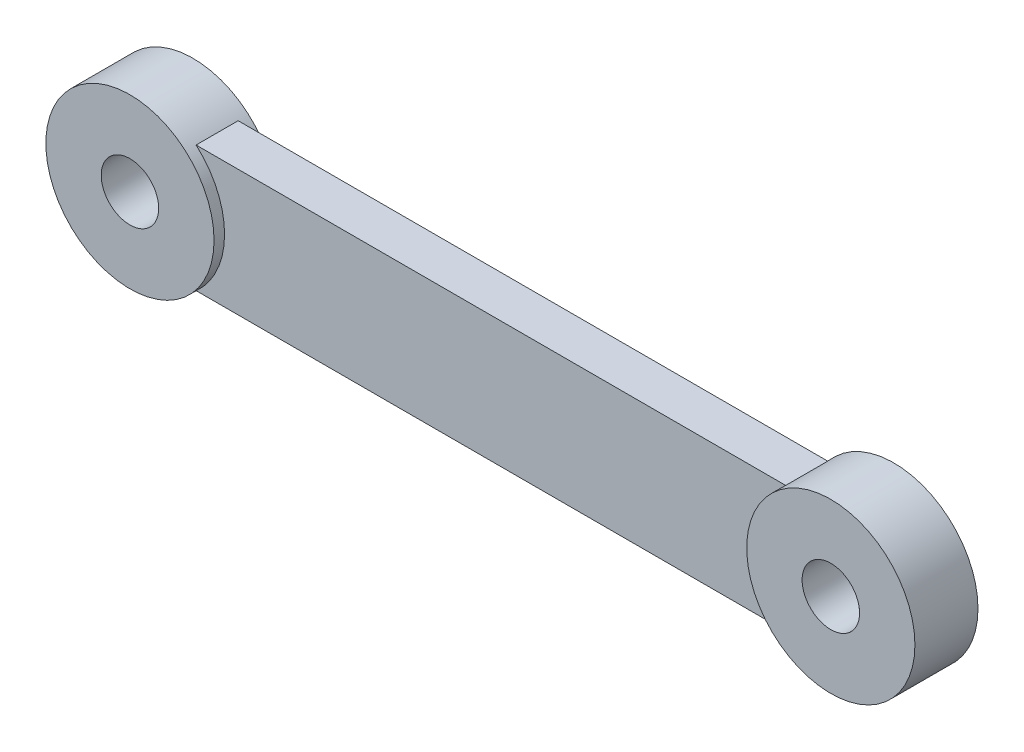
ISO-10303-21;
HEADER;
FILE_DESCRIPTION(('STEP AP214'),'2;1');
FILE_NAME('part.step','',(''),(''),'','','');
FILE_SCHEMA(('AUTOMOTIVE_DESIGN { 1 0 10303 214 1 1 1 1 }'));
ENDSEC;
DATA;
#1=APPLICATION_CONTEXT('core data for automotive mechanical design processes');
#2=APPLICATION_PROTOCOL_DEFINITION('international standard','automotive_design',2000,#1);
#3=PRODUCT_CONTEXT('',#1,'mechanical');
#4=PRODUCT('Part','Part','',(#3));
#5=PRODUCT_RELATED_PRODUCT_CATEGORY('part','',(#4));
#6=PRODUCT_DEFINITION_FORMATION('','',#4);
#7=PRODUCT_DEFINITION_CONTEXT('part definition',#1,'design');
#8=PRODUCT_DEFINITION('design','',#6,#7);
#9=PRODUCT_DEFINITION_SHAPE('','',#8);
#10=(LENGTH_UNIT() NAMED_UNIT(*) SI_UNIT(.MILLI.,.METRE.));
#11=(NAMED_UNIT(*) PLANE_ANGLE_UNIT() SI_UNIT($,.RADIAN.));
#12=(NAMED_UNIT(*) SI_UNIT($,.STERADIAN.) SOLID_ANGLE_UNIT());
#13=UNCERTAINTY_MEASURE_WITH_UNIT(LENGTH_MEASURE(1.E-05),#10,'distance_accuracy_value','');
#14=(GEOMETRIC_REPRESENTATION_CONTEXT(3) GLOBAL_UNCERTAINTY_ASSIGNED_CONTEXT((#13)) GLOBAL_UNIT_ASSIGNED_CONTEXT((#10,
#11,#12)) REPRESENTATION_CONTEXT('',''));
#15=CARTESIAN_POINT('',(0.,0.,0.));
#16=DIRECTION('',(0.,0.,1.));
#17=DIRECTION('',(1.,0.,0.));
#18=AXIS2_PLACEMENT_3D('',#15,#16,#17);
#19=CARTESIAN_POINT('',(0.,-9.,-3.));
#20=DIRECTION('',(0.,-1.,0.));
#21=DIRECTION('',(0.,0.,-1.));
#22=AXIS2_PLACEMENT_3D('',#19,#20,#21);
#23=PLANE('',#22);
#24=DIRECTION('',(0.,0.,1.));
#25=VECTOR('',#24,1.);
#26=CARTESIAN_POINT('',(42.0627460668063,-9.,-3.));
#27=LINE('',#26,#25);
#28=CARTESIAN_POINT('',(42.0627460668063,-9.,-3.));
#29=VERTEX_POINT('',#28);
#30=CARTESIAN_POINT('',(42.0627460668063,-9.,3.));
#31=VERTEX_POINT('',#30);
#32=EDGE_CURVE('E11',#29,#31,#27,.T.);
#33=ORIENTED_EDGE('',*,*,#32,.T.);
#34=DIRECTION('',(1.,0.,0.));
#35=VECTOR('',#34,1.);
#36=CARTESIAN_POINT('',(0.,-9.,3.));
#37=LINE('',#36,#35);
#38=CARTESIAN_POINT('',(-42.0627460668062,-9.,3.));
#39=VERTEX_POINT('',#38);
#40=EDGE_CURVE('E78',#39,#31,#37,.T.);
#41=ORIENTED_EDGE('',*,*,#40,.F.);
#42=DIRECTION('',(0.,0.,1.));
#43=VECTOR('',#42,1.);
#44=CARTESIAN_POINT('',(-42.0627460668062,-9.,-3.));
#45=LINE('',#44,#43);
#46=CARTESIAN_POINT('',(-42.0627460668062,-9.,-3.));
#47=VERTEX_POINT('',#46);
#48=EDGE_CURVE('E46',#47,#39,#45,.T.);
#49=ORIENTED_EDGE('',*,*,#48,.F.);
#50=DIRECTION('',(1.,0.,0.));
#51=VECTOR('',#50,1.);
#52=CARTESIAN_POINT('',(0.,-9.,-3.));
#53=LINE('',#52,#51);
#54=EDGE_CURVE('E87',#47,#29,#53,.T.);
#55=ORIENTED_EDGE('',*,*,#54,.T.);
#56=EDGE_LOOP('',(#33,#41,#49,#55));
#57=FACE_BOUND('',#56,.T.);
#58=ADVANCED_FACE('F37',(#57),#23,.T.);
#59=CARTESIAN_POINT('',(0.,9.,-3.));
#60=DIRECTION('',(0.,-1.,0.));
#61=DIRECTION('',(0.,0.,-1.));
#62=AXIS2_PLACEMENT_3D('',#59,#60,#61);
#63=PLANE('',#62);
#64=DIRECTION('',(0.,0.,1.));
#65=VECTOR('',#64,1.);
#66=CARTESIAN_POINT('',(-42.0627460668062,9.,-3.));
#67=LINE('',#66,#65);
#68=CARTESIAN_POINT('',(-42.0627460668062,9.,-3.));
#69=VERTEX_POINT('',#68);
#70=CARTESIAN_POINT('',(-42.0627460668062,9.,3.));
#71=VERTEX_POINT('',#70);
#72=EDGE_CURVE('E110',#69,#71,#67,.T.);
#73=ORIENTED_EDGE('',*,*,#72,.T.);
#74=DIRECTION('',(1.,0.,0.));
#75=VECTOR('',#74,1.);
#76=CARTESIAN_POINT('',(0.,9.,3.));
#77=LINE('',#76,#75);
#78=CARTESIAN_POINT('',(42.0627460668063,9.,3.));
#79=VERTEX_POINT('',#78);
#80=EDGE_CURVE('E92',#71,#79,#77,.T.);
#81=ORIENTED_EDGE('',*,*,#80,.T.);
#82=DIRECTION('',(0.,0.,1.));
#83=VECTOR('',#82,1.);
#84=CARTESIAN_POINT('',(42.0627460668063,9.,-3.));
#85=LINE('',#84,#83);
#86=CARTESIAN_POINT('',(42.0627460668063,9.,-3.));
#87=VERTEX_POINT('',#86);
#88=EDGE_CURVE('E41',#87,#79,#85,.T.);
#89=ORIENTED_EDGE('',*,*,#88,.F.);
#90=DIRECTION('',(1.,0.,0.));
#91=VECTOR('',#90,1.);
#92=CARTESIAN_POINT('',(0.,9.,-3.));
#93=LINE('',#92,#91);
#94=EDGE_CURVE('E105',#69,#87,#93,.T.);
#95=ORIENTED_EDGE('',*,*,#94,.F.);
#96=EDGE_LOOP('',(#73,#81,#89,#95));
#97=FACE_BOUND('',#96,.T.);
#98=ADVANCED_FACE('F39',(#97),#63,.F.);
#99=CARTESIAN_POINT('',(0.,0.,-3.));
#100=DIRECTION('',(0.,0.,1.));
#101=DIRECTION('',(1.,0.,0.));
#102=AXIS2_PLACEMENT_3D('',#99,#100,#101);
#103=PLANE('',#102);
#104=CARTESIAN_POINT('',(50.,0.,-3.));
#105=DIRECTION('',(0.,0.,1.));
#106=DIRECTION('',(1.,0.,0.));
#107=AXIS2_PLACEMENT_3D('',#104,#105,#106);
#108=CIRCLE('',#107,12.);
#109=EDGE_CURVE('E54',#87,#29,#108,.T.);
#110=ORIENTED_EDGE('',*,*,#109,.T.);
#111=ORIENTED_EDGE('',*,*,#54,.F.);
#112=CARTESIAN_POINT('',(-50.,0.,-3.));
#113=DIRECTION('',(0.,0.,1.));
#114=DIRECTION('',(1.,0.,0.));
#115=AXIS2_PLACEMENT_3D('',#112,#113,#114);
#116=CIRCLE('',#115,12.);
#117=EDGE_CURVE('E107',#47,#69,#116,.T.);
#118=ORIENTED_EDGE('',*,*,#117,.T.);
#119=ORIENTED_EDGE('',*,*,#94,.T.);
#120=EDGE_LOOP('',(#110,#111,#118,#119));
#121=FACE_BOUND('',#120,.T.);
#122=ADVANCED_FACE('F118',(#121),#103,.F.);
#123=CARTESIAN_POINT('',(0.,0.,3.));
#124=DIRECTION('',(0.,0.,1.));
#125=DIRECTION('',(1.,0.,0.));
#126=AXIS2_PLACEMENT_3D('',#123,#124,#125);
#127=PLANE('',#126);
#128=CARTESIAN_POINT('',(50.,0.,3.));
#129=DIRECTION('',(0.,0.,1.));
#130=DIRECTION('',(1.,0.,0.));
#131=AXIS2_PLACEMENT_3D('',#128,#129,#130);
#132=CIRCLE('',#131,12.);
#133=EDGE_CURVE('E81',#79,#31,#132,.T.);
#134=ORIENTED_EDGE('',*,*,#133,.F.);
#135=ORIENTED_EDGE('',*,*,#80,.F.);
#136=CARTESIAN_POINT('',(-50.,0.,3.));
#137=DIRECTION('',(0.,0.,1.));
#138=DIRECTION('',(1.,0.,0.));
#139=AXIS2_PLACEMENT_3D('',#136,#137,#138);
#140=CIRCLE('',#139,12.);
#141=EDGE_CURVE('E84',#39,#71,#140,.T.);
#142=ORIENTED_EDGE('',*,*,#141,.F.);
#143=ORIENTED_EDGE('',*,*,#40,.T.);
#144=EDGE_LOOP('',(#134,#135,#142,#143));
#145=FACE_BOUND('',#144,.T.);
#146=ADVANCED_FACE('F79',(#145),#127,.T.);
#147=CARTESIAN_POINT('',(-50.,0.,4.5));
#148=DIRECTION('',(0.,0.,-1.));
#149=DIRECTION('',(-1.,0.,0.));
#150=AXIS2_PLACEMENT_3D('',#147,#148,#149);
#151=CYLINDRICAL_SURFACE('',#150,12.);
#152=CARTESIAN_POINT('',(-50.,0.,4.5));
#153=DIRECTION('',(0.,0.,1.));
#154=DIRECTION('',(1.,0.,0.));
#155=AXIS2_PLACEMENT_3D('',#152,#153,#154);
#156=CIRCLE('',#155,12.);
#157=CARTESIAN_POINT('',(-38.,0.,4.5));
#158=VERTEX_POINT('',#157);
#159=EDGE_CURVE('E93',#158,#158,#156,.T.);
#160=ORIENTED_EDGE('',*,*,#159,.F.);
#161=EDGE_LOOP('',(#160));
#162=FACE_BOUND('',#161,.T.);
#163=CARTESIAN_POINT('',(-50.,0.,-4.5));
#164=DIRECTION('',(0.,0.,1.));
#165=DIRECTION('',(1.,0.,0.));
#166=AXIS2_PLACEMENT_3D('',#163,#164,#165);
#167=CIRCLE('',#166,12.);
#168=CARTESIAN_POINT('',(-38.,0.,-4.5));
#169=VERTEX_POINT('',#168);
#170=EDGE_CURVE('E100',#169,#169,#167,.T.);
#171=ORIENTED_EDGE('',*,*,#170,.T.);
#172=EDGE_LOOP('',(#171));
#173=FACE_BOUND('',#172,.T.);
#174=ORIENTED_EDGE('',*,*,#72,.F.);
#175=ORIENTED_EDGE('',*,*,#117,.F.);
#176=ORIENTED_EDGE('',*,*,#48,.T.);
#177=ORIENTED_EDGE('',*,*,#141,.T.);
#178=EDGE_LOOP('',(#174,#175,#176,#177));
#179=FACE_BOUND('',#178,.T.);
#180=ADVANCED_FACE('F117',(#162,#173,#179),#151,.T.);
#181=CARTESIAN_POINT('',(-50.,0.,4.5));
#182=DIRECTION('',(0.,0.,-1.));
#183=DIRECTION('',(-1.,0.,0.));
#184=AXIS2_PLACEMENT_3D('',#181,#182,#183);
#185=CYLINDRICAL_SURFACE('',#184,4.1);
#186=CARTESIAN_POINT('',(-50.,0.,4.5));
#187=DIRECTION('',(0.,0.,1.));
#188=DIRECTION('',(1.,0.,0.));
#189=AXIS2_PLACEMENT_3D('',#186,#187,#188);
#190=CIRCLE('',#189,4.1);
#191=CARTESIAN_POINT('',(-45.9,0.,4.5));
#192=VERTEX_POINT('',#191);
#193=EDGE_CURVE('E97',#192,#192,#190,.T.);
#194=ORIENTED_EDGE('',*,*,#193,.T.);
#195=EDGE_LOOP('',(#194));
#196=FACE_BOUND('',#195,.T.);
#197=CARTESIAN_POINT('',(-50.,0.,-4.5));
#198=DIRECTION('',(0.,0.,1.));
#199=DIRECTION('',(1.,0.,0.));
#200=AXIS2_PLACEMENT_3D('',#197,#198,#199);
#201=CIRCLE('',#200,4.1);
#202=CARTESIAN_POINT('',(-45.9,0.,-4.5));
#203=VERTEX_POINT('',#202);
#204=EDGE_CURVE('E242',#203,#203,#201,.T.);
#205=ORIENTED_EDGE('',*,*,#204,.F.);
#206=EDGE_LOOP('',(#205));
#207=FACE_BOUND('',#206,.T.);
#208=ADVANCED_FACE('F152',(#196,#207),#185,.F.);
#209=CARTESIAN_POINT('',(0.,0.,4.5));
#210=DIRECTION('',(0.,0.,1.));
#211=DIRECTION('',(1.,0.,0.));
#212=AXIS2_PLACEMENT_3D('',#209,#210,#211);
#213=PLANE('',#212);
#214=ORIENTED_EDGE('',*,*,#193,.F.);
#215=EDGE_LOOP('',(#214));
#216=FACE_BOUND('',#215,.T.);
#217=ORIENTED_EDGE('',*,*,#159,.T.);
#218=EDGE_LOOP('',(#217));
#219=FACE_BOUND('',#218,.T.);
#220=ADVANCED_FACE('F162',(#216,#219),#213,.T.);
#221=CARTESIAN_POINT('',(0.,0.,-4.5));
#222=DIRECTION('',(0.,0.,1.));
#223=DIRECTION('',(1.,0.,0.));
#224=AXIS2_PLACEMENT_3D('',#221,#222,#223);
#225=PLANE('',#224);
#226=ORIENTED_EDGE('',*,*,#204,.T.);
#227=EDGE_LOOP('',(#226));
#228=FACE_BOUND('',#227,.T.);
#229=ORIENTED_EDGE('',*,*,#170,.F.);
#230=EDGE_LOOP('',(#229));
#231=FACE_BOUND('',#230,.T.);
#232=ADVANCED_FACE('F172',(#228,#231),#225,.F.);
#233=CARTESIAN_POINT('',(50.,0.,4.5));
#234=DIRECTION('',(0.,0.,-1.));
#235=DIRECTION('',(-1.,0.,0.));
#236=AXIS2_PLACEMENT_3D('',#233,#234,#235);
#237=CYLINDRICAL_SURFACE('',#236,12.);
#238=CARTESIAN_POINT('',(50.,0.,4.5));
#239=DIRECTION('',(0.,0.,1.));
#240=DIRECTION('',(1.,0.,0.));
#241=AXIS2_PLACEMENT_3D('',#238,#239,#240);
#242=CIRCLE('',#241,12.);
#243=CARTESIAN_POINT('',(62.,0.,4.5));
#244=VERTEX_POINT('',#243);
#245=EDGE_CURVE('E236',#244,#244,#242,.T.);
#246=ORIENTED_EDGE('',*,*,#245,.F.);
#247=EDGE_LOOP('',(#246));
#248=FACE_BOUND('',#247,.T.);
#249=CARTESIAN_POINT('',(50.,0.,-4.5));
#250=DIRECTION('',(0.,0.,1.));
#251=DIRECTION('',(1.,0.,0.));
#252=AXIS2_PLACEMENT_3D('',#249,#250,#251);
#253=CIRCLE('',#252,12.);
#254=CARTESIAN_POINT('',(62.,0.,-4.5));
#255=VERTEX_POINT('',#254);
#256=EDGE_CURVE('E231',#255,#255,#253,.T.);
#257=ORIENTED_EDGE('',*,*,#256,.T.);
#258=EDGE_LOOP('',(#257));
#259=FACE_BOUND('',#258,.T.);
#260=ORIENTED_EDGE('',*,*,#32,.F.);
#261=ORIENTED_EDGE('',*,*,#109,.F.);
#262=ORIENTED_EDGE('',*,*,#88,.T.);
#263=ORIENTED_EDGE('',*,*,#133,.T.);
#264=EDGE_LOOP('',(#260,#261,#262,#263));
#265=FACE_BOUND('',#264,.T.);
#266=ADVANCED_FACE('F90',(#248,#259,#265),#237,.T.);
#267=CARTESIAN_POINT('',(50.,0.,4.5));
#268=DIRECTION('',(0.,0.,-1.));
#269=DIRECTION('',(-1.,0.,0.));
#270=AXIS2_PLACEMENT_3D('',#267,#268,#269);
#271=CYLINDRICAL_SURFACE('',#270,4.1);
#272=CARTESIAN_POINT('',(50.,0.,4.5));
#273=DIRECTION('',(0.,0.,1.));
#274=DIRECTION('',(1.,0.,0.));
#275=AXIS2_PLACEMENT_3D('',#272,#273,#274);
#276=CIRCLE('',#275,4.1);
#277=CARTESIAN_POINT('',(54.1,0.,4.5));
#278=VERTEX_POINT('',#277);
#279=EDGE_CURVE('E233',#278,#278,#276,.T.);
#280=ORIENTED_EDGE('',*,*,#279,.T.);
#281=EDGE_LOOP('',(#280));
#282=FACE_BOUND('',#281,.T.);
#283=CARTESIAN_POINT('',(50.,0.,-4.5));
#284=DIRECTION('',(0.,0.,1.));
#285=DIRECTION('',(1.,0.,0.));
#286=AXIS2_PLACEMENT_3D('',#283,#284,#285);
#287=CIRCLE('',#286,4.1);
#288=CARTESIAN_POINT('',(54.1,0.,-4.5));
#289=VERTEX_POINT('',#288);
#290=EDGE_CURVE('E228',#289,#289,#287,.T.);
#291=ORIENTED_EDGE('',*,*,#290,.F.);
#292=EDGE_LOOP('',(#291));
#293=FACE_BOUND('',#292,.T.);
#294=ADVANCED_FACE('F191',(#282,#293),#271,.F.);
#295=CARTESIAN_POINT('',(0.,0.,4.5));
#296=DIRECTION('',(0.,0.,1.));
#297=DIRECTION('',(1.,0.,0.));
#298=AXIS2_PLACEMENT_3D('',#295,#296,#297);
#299=PLANE('',#298);
#300=ORIENTED_EDGE('',*,*,#279,.F.);
#301=EDGE_LOOP('',(#300));
#302=FACE_BOUND('',#301,.T.);
#303=ORIENTED_EDGE('',*,*,#245,.T.);
#304=EDGE_LOOP('',(#303));
#305=FACE_BOUND('',#304,.T.);
#306=ADVANCED_FACE('F201',(#302,#305),#299,.T.);
#307=CARTESIAN_POINT('',(0.,0.,-4.5));
#308=DIRECTION('',(0.,0.,1.));
#309=DIRECTION('',(1.,0.,0.));
#310=AXIS2_PLACEMENT_3D('',#307,#308,#309);
#311=PLANE('',#310);
#312=ORIENTED_EDGE('',*,*,#290,.T.);
#313=EDGE_LOOP('',(#312));
#314=FACE_BOUND('',#313,.T.);
#315=ORIENTED_EDGE('',*,*,#256,.F.);
#316=EDGE_LOOP('',(#315));
#317=FACE_BOUND('',#316,.T.);
#318=ADVANCED_FACE('F211',(#314,#317),#311,.F.);
#319=CLOSED_SHELL('',(#58,#98,#122,#146,#180,#208,#220,#232,#266,#294,#306,#318));
#320=MANIFOLD_SOLID_BREP('B2',#319);
#321=ADVANCED_BREP_SHAPE_REPRESENTATION('',(#18,#320),#14);
#322=SHAPE_DEFINITION_REPRESENTATION(#9,#321);
ENDSEC;
END-ISO-10303-21;
